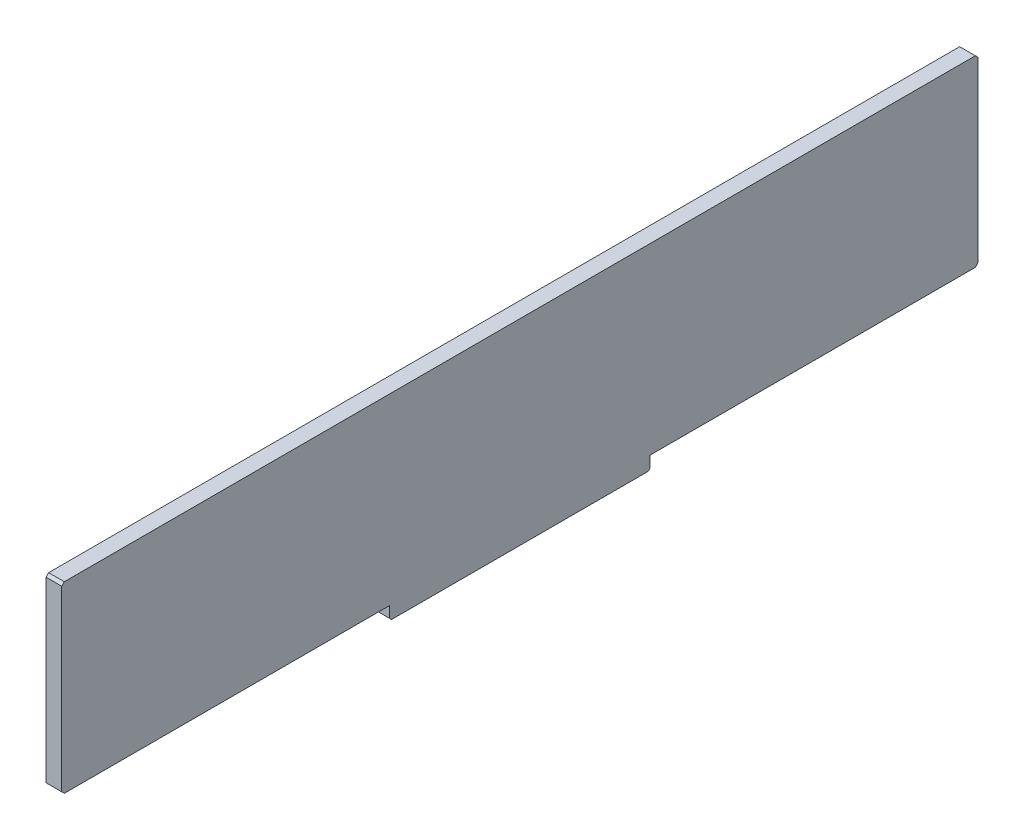
ISO-10303-21;
HEADER;
FILE_DESCRIPTION(('STEP AP214'),'2;1');
FILE_NAME('part.step','',(''),(''),'','','');
FILE_SCHEMA(('AUTOMOTIVE_DESIGN { 1 0 10303 214 1 1 1 1 }'));
ENDSEC;
DATA;
#1=APPLICATION_CONTEXT('core data for automotive mechanical design processes');
#2=APPLICATION_PROTOCOL_DEFINITION('international standard','automotive_design',2000,#1);
#3=PRODUCT_CONTEXT('',#1,'mechanical');
#4=PRODUCT('Part','Part','',(#3));
#5=PRODUCT_RELATED_PRODUCT_CATEGORY('part','',(#4));
#6=PRODUCT_DEFINITION_FORMATION('','',#4);
#7=PRODUCT_DEFINITION_CONTEXT('part definition',#1,'design');
#8=PRODUCT_DEFINITION('design','',#6,#7);
#9=PRODUCT_DEFINITION_SHAPE('','',#8);
#10=(LENGTH_UNIT() NAMED_UNIT(*) SI_UNIT(.MILLI.,.METRE.));
#11=(NAMED_UNIT(*) PLANE_ANGLE_UNIT() SI_UNIT($,.RADIAN.));
#12=(NAMED_UNIT(*) SI_UNIT($,.STERADIAN.) SOLID_ANGLE_UNIT());
#13=UNCERTAINTY_MEASURE_WITH_UNIT(LENGTH_MEASURE(1.E-05),#10,'distance_accuracy_value','');
#14=(GEOMETRIC_REPRESENTATION_CONTEXT(3) GLOBAL_UNCERTAINTY_ASSIGNED_CONTEXT((#13)) GLOBAL_UNIT_ASSIGNED_CONTEXT((#10,
#11,#12)) REPRESENTATION_CONTEXT('',''));
#15=CARTESIAN_POINT('',(0.,0.,0.));
#16=DIRECTION('',(0.,0.,1.));
#17=DIRECTION('',(1.,0.,0.));
#18=AXIS2_PLACEMENT_3D('',#15,#16,#17);
#19=CARTESIAN_POINT('',(68.3493649053885,-37.5,-168.284572681198));
#20=DIRECTION('',(0.,0.,-1.));
#21=DIRECTION('',(-1.,0.,0.));
#22=AXIS2_PLACEMENT_3D('',#19,#20,#21);
#23=PLANE('',#22);
#24=DIRECTION('',(0.,1.,0.));
#25=VECTOR('',#24,1.);
#26=CARTESIAN_POINT('',(68.3493649053885,-37.5,-168.284572681198));
#27=LINE('',#26,#25);
#28=CARTESIAN_POINT('',(68.3493649053885,-37.1,-168.284572681198));
#29=VERTEX_POINT('',#28);
#30=CARTESIAN_POINT('',(68.3493649053885,-35.,-168.284572681198));
#31=VERTEX_POINT('',#30);
#32=EDGE_CURVE('E180',#29,#31,#27,.T.);
#33=ORIENTED_EDGE('',*,*,#32,.F.);
#34=DIRECTION('',(-1.,0.,0.));
#35=VECTOR('',#34,1.);
#36=CARTESIAN_POINT('',(68.3493649053885,-37.1,-168.284572681198));
#37=LINE('',#36,#35);
#38=CARTESIAN_POINT('',(65.3493649053885,-37.1,-168.284572681198));
#39=VERTEX_POINT('',#38);
#40=EDGE_CURVE('E43',#29,#39,#37,.T.);
#41=ORIENTED_EDGE('',*,*,#40,.T.);
#42=DIRECTION('',(0.,1.,0.));
#43=VECTOR('',#42,1.);
#44=CARTESIAN_POINT('',(65.3493649053885,-37.5,-168.284572681198));
#45=LINE('',#44,#43);
#46=CARTESIAN_POINT('',(65.3493649053885,-35.,-168.284572681198));
#47=VERTEX_POINT('',#46);
#48=EDGE_CURVE('E170',#39,#47,#45,.T.);
#49=ORIENTED_EDGE('',*,*,#48,.T.);
#50=DIRECTION('',(-1.,0.,0.));
#51=VECTOR('',#50,1.);
#52=CARTESIAN_POINT('',(68.3493649053885,-35.,-168.284572681198));
#53=LINE('',#52,#51);
#54=EDGE_CURVE('E176',#31,#47,#53,.T.);
#55=ORIENTED_EDGE('',*,*,#54,.F.);
#56=EDGE_LOOP('',(#33,#41,#49,#55));
#57=FACE_BOUND('',#56,.T.);
#58=ADVANCED_FACE('F40',(#57),#23,.T.);
#59=CARTESIAN_POINT('',(68.3493649053885,-37.5,-168.384572681198));
#60=DIRECTION('',(-1.,0.,0.));
#61=DIRECTION('',(0.,0.,1.));
#62=AXIS2_PLACEMENT_3D('',#59,#60,#61);
#63=PLANE('',#62);
#64=DIRECTION('',(0.,1.,0.));
#65=VECTOR('',#64,1.);
#66=CARTESIAN_POINT('',(68.3493649053885,-37.5,-118.484572681198));
#67=LINE('',#66,#65);
#68=CARTESIAN_POINT('',(68.3493649053885,-37.1,-118.484572681198));
#69=VERTEX_POINT('',#68);
#70=CARTESIAN_POINT('',(68.3493649053885,-35.,-118.484572681198));
#71=VERTEX_POINT('',#70);
#72=EDGE_CURVE('E169',#69,#71,#67,.T.);
#73=ORIENTED_EDGE('',*,*,#72,.F.);
#74=DIRECTION('',(0.,0.707106781186557,0.707106781186538));
#75=VECTOR('',#74,1.);
#76=CARTESIAN_POINT('',(68.3493649053885,-37.4999999999999,-118.884572681198));
#77=LINE('',#76,#75);
#78=CARTESIAN_POINT('',(68.3493649053885,-37.5,-118.884572681198));
#79=VERTEX_POINT('',#78);
#80=EDGE_CURVE('E243',#69,#79,#77,.F.);
#81=ORIENTED_EDGE('',*,*,#80,.T.);
#82=DIRECTION('',(0.,0.,1.));
#83=VECTOR('',#82,1.);
#84=CARTESIAN_POINT('',(68.3493649053885,-37.5,-168.384572681198));
#85=LINE('',#84,#83);
#86=CARTESIAN_POINT('',(68.3493649053885,-37.5,-167.884572681198));
#87=VERTEX_POINT('',#86);
#88=EDGE_CURVE('E191',#87,#79,#85,.T.);
#89=ORIENTED_EDGE('',*,*,#88,.F.);
#90=DIRECTION('',(0.,0.707106781186538,-0.707106781186557));
#91=VECTOR('',#90,1.);
#92=CARTESIAN_POINT('',(68.3493649053885,-37.,-168.384572681198));
#93=LINE('',#92,#91);
#94=EDGE_CURVE('E239',#87,#29,#93,.T.);
#95=ORIENTED_EDGE('',*,*,#94,.T.);
#96=ORIENTED_EDGE('',*,*,#32,.T.);
#97=DIRECTION('',(0.,0.,-1.));
#98=VECTOR('',#97,1.);
#99=CARTESIAN_POINT('',(68.3493649053884,-35.,-55.8845726812005));
#100=LINE('',#99,#98);
#101=CARTESIAN_POINT('',(68.3493649053885,-35.,-230.3845726812));
#102=VERTEX_POINT('',#101);
#103=EDGE_CURVE('E147',#31,#102,#100,.T.);
#104=ORIENTED_EDGE('',*,*,#103,.T.);
#105=DIRECTION('',(0.,-0.707106781186548,0.707106781186547));
#106=VECTOR('',#105,1.);
#107=CARTESIAN_POINT('',(68.3493649053885,-35.,-230.3845726812));
#108=LINE('',#107,#106);
#109=CARTESIAN_POINT('',(68.3493649053885,-34.5,-230.8845726812));
#110=VERTEX_POINT('',#109);
#111=EDGE_CURVE('E233',#102,#110,#108,.F.);
#112=ORIENTED_EDGE('',*,*,#111,.T.);
#113=DIRECTION('',(0.,1.,0.));
#114=VECTOR('',#113,1.);
#115=CARTESIAN_POINT('',(68.3493649053885,0.,-230.8845726812));
#116=LINE('',#115,#114);
#117=CARTESIAN_POINT('',(68.3493649053885,-0.5,-230.8845726812));
#118=VERTEX_POINT('',#117);
#119=EDGE_CURVE('E282',#110,#118,#116,.T.);
#120=ORIENTED_EDGE('',*,*,#119,.T.);
#121=DIRECTION('',(0.,-0.707106781186599,-0.707106781186496));
#122=VECTOR('',#121,1.);
#123=CARTESIAN_POINT('',(68.3493649053885,-0.5,-230.8845726812));
#124=LINE('',#123,#122);
#125=CARTESIAN_POINT('',(68.3493649053885,0.,-230.384572681201));
#126=VERTEX_POINT('',#125);
#127=EDGE_CURVE('E236',#118,#126,#124,.F.);
#128=ORIENTED_EDGE('',*,*,#127,.T.);
#129=DIRECTION('',(0.,0.,1.));
#130=VECTOR('',#129,1.);
#131=CARTESIAN_POINT('',(68.3493649053884,0.,-55.8845726812005));
#132=LINE('',#131,#130);
#133=CARTESIAN_POINT('',(68.3493649053884,0.,-56.3845726812005));
#134=VERTEX_POINT('',#133);
#135=EDGE_CURVE('E129',#126,#134,#132,.T.);
#136=ORIENTED_EDGE('',*,*,#135,.T.);
#137=DIRECTION('',(0.,0.707106781186544,-0.707106781186551));
#138=VECTOR('',#137,1.);
#139=CARTESIAN_POINT('',(68.3493649053885,0.,-56.3845726812005));
#140=LINE('',#139,#138);
#141=CARTESIAN_POINT('',(68.3493649053884,-0.500000000000049,-55.8845726812005));
#142=VERTEX_POINT('',#141);
#143=EDGE_CURVE('E123',#134,#142,#140,.F.);
#144=ORIENTED_EDGE('',*,*,#143,.T.);
#145=DIRECTION('',(0.,-1.,0.));
#146=VECTOR('',#145,1.);
#147=CARTESIAN_POINT('',(68.3493649053884,0.,-55.8845726812005));
#148=LINE('',#147,#146);
#149=CARTESIAN_POINT('',(68.3493649053884,-34.4999999999999,-55.8845726812005));
#150=VERTEX_POINT('',#149);
#151=EDGE_CURVE('E127',#142,#150,#148,.T.);
#152=ORIENTED_EDGE('',*,*,#151,.T.);
#153=DIRECTION('',(0.,0.707106781186584,0.707106781186512));
#154=VECTOR('',#153,1.);
#155=CARTESIAN_POINT('',(68.3493649053885,-34.4999999999999,-55.8845726812005));
#156=LINE('',#155,#154);
#157=CARTESIAN_POINT('',(68.3493649053884,-35.,-56.3845726812005));
#158=VERTEX_POINT('',#157);
#159=EDGE_CURVE('E59',#150,#158,#156,.F.);
#160=ORIENTED_EDGE('',*,*,#159,.T.);
#161=EDGE_CURVE('E286',#158,#71,#100,.T.);
#162=ORIENTED_EDGE('',*,*,#161,.T.);
#163=EDGE_LOOP('',(#73,#81,#89,#95,#96,#104,#112,#120,#128,#136,#144,#152,#160,#162));
#164=FACE_BOUND('',#163,.T.);
#165=ADVANCED_FACE('F126',(#164),#63,.F.);
#166=CARTESIAN_POINT('',(68.3493649053885,-37.5,-118.484572681198));
#167=DIRECTION('',(0.,0.,-1.));
#168=DIRECTION('',(-1.,0.,0.));
#169=AXIS2_PLACEMENT_3D('',#166,#167,#168);
#170=PLANE('',#169);
#171=DIRECTION('',(0.,1.,0.));
#172=VECTOR('',#171,1.);
#173=CARTESIAN_POINT('',(65.3493649053885,-37.5,-118.484572681198));
#174=LINE('',#173,#172);
#175=CARTESIAN_POINT('',(65.3493649053885,-37.1,-118.484572681198));
#176=VERTEX_POINT('',#175);
#177=CARTESIAN_POINT('',(65.3493649053885,-35.,-118.484572681198));
#178=VERTEX_POINT('',#177);
#179=EDGE_CURVE('E165',#176,#178,#174,.T.);
#180=ORIENTED_EDGE('',*,*,#179,.F.);
#181=DIRECTION('',(-1.,0.,0.));
#182=VECTOR('',#181,1.);
#183=CARTESIAN_POINT('',(-111.650635094611,-37.1,-118.484572681198));
#184=LINE('',#183,#182);
#185=EDGE_CURVE('E135',#176,#69,#184,.F.);
#186=ORIENTED_EDGE('',*,*,#185,.T.);
#187=ORIENTED_EDGE('',*,*,#72,.T.);
#188=DIRECTION('',(-1.,0.,0.));
#189=VECTOR('',#188,1.);
#190=CARTESIAN_POINT('',(68.3493649053885,-35.,-118.484572681198));
#191=LINE('',#190,#189);
#192=EDGE_CURVE('E171',#71,#178,#191,.T.);
#193=ORIENTED_EDGE('',*,*,#192,.T.);
#194=EDGE_LOOP('',(#180,#186,#187,#193));
#195=FACE_BOUND('',#194,.T.);
#196=ADVANCED_FACE('F354',(#195),#170,.F.);
#197=CARTESIAN_POINT('',(65.3493649053885,-37.5,-168.384572681198));
#198=DIRECTION('',(-1.,0.,0.));
#199=DIRECTION('',(0.,0.,1.));
#200=AXIS2_PLACEMENT_3D('',#197,#198,#199);
#201=PLANE('',#200);
#202=DIRECTION('',(0.,0.,1.));
#203=VECTOR('',#202,1.);
#204=CARTESIAN_POINT('',(65.3493649053885,-37.5,-168.384572681198));
#205=LINE('',#204,#203);
#206=CARTESIAN_POINT('',(65.3493649053885,-37.5,-167.884572681198));
#207=VERTEX_POINT('',#206);
#208=CARTESIAN_POINT('',(65.3493649053885,-37.5,-118.884572681198));
#209=VERTEX_POINT('',#208);
#210=EDGE_CURVE('E175',#207,#209,#205,.T.);
#211=ORIENTED_EDGE('',*,*,#210,.T.);
#212=DIRECTION('',(0.,-0.707106781186557,-0.707106781186538));
#213=VECTOR('',#212,1.);
#214=CARTESIAN_POINT('',(65.3493649053885,-62.25,-143.634572681197));
#215=LINE('',#214,#213);
#216=EDGE_CURVE('E183',#209,#176,#215,.F.);
#217=ORIENTED_EDGE('',*,*,#216,.T.);
#218=ORIENTED_EDGE('',*,*,#179,.T.);
#219=DIRECTION('',(0.,0.,-1.));
#220=VECTOR('',#219,1.);
#221=CARTESIAN_POINT('',(65.3493649053884,-35.,-55.8845726812005));
#222=LINE('',#221,#220);
#223=CARTESIAN_POINT('',(65.3493649053885,-35.,-56.3845726812005));
#224=VERTEX_POINT('',#223);
#225=EDGE_CURVE('E296',#224,#178,#222,.T.);
#226=ORIENTED_EDGE('',*,*,#225,.F.);
#227=DIRECTION('',(0.,-0.707106781186584,-0.707106781186512));
#228=VECTOR('',#227,1.);
#229=CARTESIAN_POINT('',(65.3493649053885,-92.2499999999989,-113.634572681194));
#230=LINE('',#229,#228);
#231=CARTESIAN_POINT('',(65.3493649053884,-34.4999999999999,-55.8845726812005));
#232=VERTEX_POINT('',#231);
#233=EDGE_CURVE('E218',#224,#232,#230,.F.);
#234=ORIENTED_EDGE('',*,*,#233,.T.);
#235=DIRECTION('',(0.,-1.,0.));
#236=VECTOR('',#235,1.);
#237=CARTESIAN_POINT('',(65.3493649053884,0.,-55.8845726812005));
#238=LINE('',#237,#236);
#239=CARTESIAN_POINT('',(65.3493649053884,-0.500000000000049,-55.8845726812005));
#240=VERTEX_POINT('',#239);
#241=EDGE_CURVE('E291',#240,#232,#238,.T.);
#242=ORIENTED_EDGE('',*,*,#241,.F.);
#243=DIRECTION('',(0.,-0.707106781186544,0.707106781186551));
#244=VECTOR('',#243,1.);
#245=CARTESIAN_POINT('',(65.3493649053885,37.249999999999,-93.6345726811999));
#246=LINE('',#245,#244);
#247=CARTESIAN_POINT('',(65.3493649053885,0.,-56.3845726812005));
#248=VERTEX_POINT('',#247);
#249=EDGE_CURVE('E152',#240,#248,#246,.F.);
#250=ORIENTED_EDGE('',*,*,#249,.T.);
#251=DIRECTION('',(0.,0.,1.));
#252=VECTOR('',#251,1.);
#253=CARTESIAN_POINT('',(65.3493649053884,0.,-55.8845726812005));
#254=LINE('',#253,#252);
#255=CARTESIAN_POINT('',(65.3493649053885,0.,-230.384572681201));
#256=VERTEX_POINT('',#255);
#257=EDGE_CURVE('E189',#256,#248,#254,.T.);
#258=ORIENTED_EDGE('',*,*,#257,.F.);
#259=DIRECTION('',(0.,0.707106781186599,0.707106781186496));
#260=VECTOR('',#259,1.);
#261=CARTESIAN_POINT('',(65.3493649053886,12.2499999999985,-218.134572681204));
#262=LINE('',#261,#260);
#263=CARTESIAN_POINT('',(65.3493649053885,-0.5,-230.8845726812));
#264=VERTEX_POINT('',#263);
#265=EDGE_CURVE('E224',#256,#264,#262,.F.);
#266=ORIENTED_EDGE('',*,*,#265,.T.);
#267=DIRECTION('',(0.,1.,0.));
#268=VECTOR('',#267,1.);
#269=CARTESIAN_POINT('',(65.3493649053885,0.,-230.8845726812));
#270=LINE('',#269,#268);
#271=CARTESIAN_POINT('',(65.3493649053885,-34.5,-230.8845726812));
#272=VERTEX_POINT('',#271);
#273=EDGE_CURVE('E274',#272,#264,#270,.T.);
#274=ORIENTED_EDGE('',*,*,#273,.F.);
#275=DIRECTION('',(0.,0.707106781186548,-0.707106781186547));
#276=VECTOR('',#275,1.);
#277=CARTESIAN_POINT('',(65.3493649053885,-67.2500000000012,-198.134572681199));
#278=LINE('',#277,#276);
#279=CARTESIAN_POINT('',(65.3493649053885,-35.,-230.3845726812));
#280=VERTEX_POINT('',#279);
#281=EDGE_CURVE('E100',#272,#280,#278,.F.);
#282=ORIENTED_EDGE('',*,*,#281,.T.);
#283=EDGE_CURVE('E299',#47,#280,#222,.T.);
#284=ORIENTED_EDGE('',*,*,#283,.F.);
#285=ORIENTED_EDGE('',*,*,#48,.F.);
#286=DIRECTION('',(0.,-0.707106781186538,0.707106781186557));
#287=VECTOR('',#286,1.);
#288=CARTESIAN_POINT('',(65.3493649053885,-37.25,-168.134572681198));
#289=LINE('',#288,#287);
#290=EDGE_CURVE('E91',#39,#207,#289,.T.);
#291=ORIENTED_EDGE('',*,*,#290,.T.);
#292=EDGE_LOOP('',(#211,#217,#218,#226,#234,#242,#250,#258,#266,#274,#282,#284,#285,#291));
#293=FACE_BOUND('',#292,.T.);
#294=ADVANCED_FACE('F271',(#293),#201,.T.);
#295=CARTESIAN_POINT('',(-111.650635094611,-37.5,-143.3845726812));
#296=DIRECTION('',(0.,1.,0.));
#297=DIRECTION('',(-0.866025403784445,0.,0.499999999999988));
#298=AXIS2_PLACEMENT_3D('',#295,#296,#297);
#299=PLANE('',#298);
#300=ORIENTED_EDGE('',*,*,#88,.T.);
#301=DIRECTION('',(-1.,0.,0.));
#302=VECTOR('',#301,1.);
#303=CARTESIAN_POINT('',(-111.650635094611,-37.5,-118.884572681198));
#304=LINE('',#303,#302);
#305=EDGE_CURVE('E213',#79,#209,#304,.T.);
#306=ORIENTED_EDGE('',*,*,#305,.T.);
#307=ORIENTED_EDGE('',*,*,#210,.F.);
#308=DIRECTION('',(1.,0.,0.));
#309=VECTOR('',#308,1.);
#310=CARTESIAN_POINT('',(68.3493649053885,-37.5,-167.884572681198));
#311=LINE('',#310,#309);
#312=EDGE_CURVE('E186',#207,#87,#311,.T.);
#313=ORIENTED_EDGE('',*,*,#312,.T.);
#314=EDGE_LOOP('',(#300,#306,#307,#313));
#315=FACE_BOUND('',#314,.T.);
#316=ADVANCED_FACE('F321',(#315),#299,.F.);
#317=CARTESIAN_POINT('',(65.3493649053884,-35.,-55.8845726812005));
#318=DIRECTION('',(0.,-1.,0.));
#319=DIRECTION('',(0.499999999999988,0.,0.866025403784445));
#320=AXIS2_PLACEMENT_3D('',#317,#318,#319);
#321=PLANE('',#320);
#322=ORIENTED_EDGE('',*,*,#161,.F.);
#323=DIRECTION('',(-1.,0.,0.));
#324=VECTOR('',#323,1.);
#325=CARTESIAN_POINT('',(65.3493649053885,-35.,-56.3845726812005));
#326=LINE('',#325,#324);
#327=EDGE_CURVE('E12',#158,#224,#326,.T.);
#328=ORIENTED_EDGE('',*,*,#327,.T.);
#329=ORIENTED_EDGE('',*,*,#225,.T.);
#330=ORIENTED_EDGE('',*,*,#192,.F.);
#331=EDGE_LOOP('',(#322,#328,#329,#330));
#332=FACE_BOUND('',#331,.T.);
#333=ADVANCED_FACE('F365',(#332),#321,.T.);
#334=CARTESIAN_POINT('',(65.3493649053884,0.,-55.8845726812005));
#335=DIRECTION('',(0.,0.,1.));
#336=DIRECTION('',(1.,0.,0.));
#337=AXIS2_PLACEMENT_3D('',#334,#335,#336);
#338=PLANE('',#337);
#339=ORIENTED_EDGE('',*,*,#241,.T.);
#340=DIRECTION('',(1.,0.,0.));
#341=VECTOR('',#340,1.);
#342=CARTESIAN_POINT('',(65.3493649053884,-34.4999999999999,-55.8845726812005));
#343=LINE('',#342,#341);
#344=EDGE_CURVE('E50',#232,#150,#343,.T.);
#345=ORIENTED_EDGE('',*,*,#344,.T.);
#346=ORIENTED_EDGE('',*,*,#151,.F.);
#347=DIRECTION('',(-1.,0.,0.));
#348=VECTOR('',#347,1.);
#349=CARTESIAN_POINT('',(65.3493649053884,-0.500000000000049,-55.8845726812005));
#350=LINE('',#349,#348);
#351=EDGE_CURVE('E143',#142,#240,#350,.T.);
#352=ORIENTED_EDGE('',*,*,#351,.T.);
#353=EDGE_LOOP('',(#339,#345,#346,#352));
#354=FACE_BOUND('',#353,.T.);
#355=ADVANCED_FACE('F141',(#354),#338,.T.);
#356=CARTESIAN_POINT('',(65.3493649053884,0.,-55.8845726812005));
#357=DIRECTION('',(0.,1.,0.));
#358=DIRECTION('',(-0.499999999999988,0.,-0.866025403784445));
#359=AXIS2_PLACEMENT_3D('',#356,#357,#358);
#360=PLANE('',#359);
#361=ORIENTED_EDGE('',*,*,#135,.F.);
#362=DIRECTION('',(-1.,0.,0.));
#363=VECTOR('',#362,1.);
#364=CARTESIAN_POINT('',(65.3493649053885,0.,-230.384572681201));
#365=LINE('',#364,#363);
#366=EDGE_CURVE('E161',#126,#256,#365,.T.);
#367=ORIENTED_EDGE('',*,*,#366,.T.);
#368=ORIENTED_EDGE('',*,*,#257,.T.);
#369=DIRECTION('',(1.,0.,0.));
#370=VECTOR('',#369,1.);
#371=CARTESIAN_POINT('',(65.3493649053885,0.,-56.3845726812005));
#372=LINE('',#371,#370);
#373=EDGE_CURVE('E255',#248,#134,#372,.T.);
#374=ORIENTED_EDGE('',*,*,#373,.T.);
#375=EDGE_LOOP('',(#361,#367,#368,#374));
#376=FACE_BOUND('',#375,.T.);
#377=ADVANCED_FACE('F265',(#376),#360,.T.);
#378=CARTESIAN_POINT('',(65.3493649053885,0.,-230.8845726812));
#379=DIRECTION('',(0.,0.,-1.));
#380=DIRECTION('',(-1.,0.,0.));
#381=AXIS2_PLACEMENT_3D('',#378,#379,#380);
#382=PLANE('',#381);
#383=ORIENTED_EDGE('',*,*,#273,.T.);
#384=DIRECTION('',(1.,0.,0.));
#385=VECTOR('',#384,1.);
#386=CARTESIAN_POINT('',(65.3493649053885,-0.5,-230.8845726812));
#387=LINE('',#386,#385);
#388=EDGE_CURVE('E251',#264,#118,#387,.T.);
#389=ORIENTED_EDGE('',*,*,#388,.T.);
#390=ORIENTED_EDGE('',*,*,#119,.F.);
#391=DIRECTION('',(-1.,0.,0.));
#392=VECTOR('',#391,1.);
#393=CARTESIAN_POINT('',(65.3493649053885,-34.5,-230.8845726812));
#394=LINE('',#393,#392);
#395=EDGE_CURVE('E247',#110,#272,#394,.T.);
#396=ORIENTED_EDGE('',*,*,#395,.T.);
#397=EDGE_LOOP('',(#383,#389,#390,#396));
#398=FACE_BOUND('',#397,.T.);
#399=ADVANCED_FACE('F281',(#398),#382,.T.);
#400=ORIENTED_EDGE('',*,*,#283,.T.);
#401=DIRECTION('',(1.,0.,0.));
#402=VECTOR('',#401,1.);
#403=CARTESIAN_POINT('',(65.3493649053885,-35.,-230.3845726812));
#404=LINE('',#403,#402);
#405=EDGE_CURVE('E154',#280,#102,#404,.T.);
#406=ORIENTED_EDGE('',*,*,#405,.T.);
#407=ORIENTED_EDGE('',*,*,#103,.F.);
#408=ORIENTED_EDGE('',*,*,#54,.T.);
#409=EDGE_LOOP('',(#400,#406,#407,#408));
#410=FACE_BOUND('',#409,.T.);
#411=ADVANCED_FACE('F306',(#410),#321,.T.);
#412=CARTESIAN_POINT('',(-111.650635094611,-37.5,-118.884572681198));
#413=DIRECTION('',(0.,0.707106781186538,-0.707106781186557));
#414=DIRECTION('',(-1.,0.,0.));
#415=AXIS2_PLACEMENT_3D('',#412,#413,#414);
#416=PLANE('',#415);
#417=ORIENTED_EDGE('',*,*,#80,.F.);
#418=ORIENTED_EDGE('',*,*,#185,.F.);
#419=ORIENTED_EDGE('',*,*,#216,.F.);
#420=ORIENTED_EDGE('',*,*,#305,.F.);
#421=EDGE_LOOP('',(#417,#418,#419,#420));
#422=FACE_BOUND('',#421,.T.);
#423=ADVANCED_FACE('F356',(#422),#416,.F.);
#424=CARTESIAN_POINT('',(68.3493649053885,-37.,-168.384572681198));
#425=DIRECTION('',(0.,-0.707106781186557,-0.707106781186538));
#426=DIRECTION('',(1.,0.,0.));
#427=AXIS2_PLACEMENT_3D('',#424,#425,#426);
#428=PLANE('',#427);
#429=ORIENTED_EDGE('',*,*,#94,.F.);
#430=ORIENTED_EDGE('',*,*,#312,.F.);
#431=ORIENTED_EDGE('',*,*,#290,.F.);
#432=ORIENTED_EDGE('',*,*,#40,.F.);
#433=EDGE_LOOP('',(#429,#430,#431,#432));
#434=FACE_BOUND('',#433,.T.);
#435=ADVANCED_FACE('F325',(#434),#428,.T.);
#436=CARTESIAN_POINT('',(65.3493649053885,-0.5,-230.8845726812));
#437=DIRECTION('',(0.,-0.707106781186496,0.707106781186599));
#438=DIRECTION('',(1.,0.,0.));
#439=AXIS2_PLACEMENT_3D('',#436,#437,#438);
#440=PLANE('',#439);
#441=ORIENTED_EDGE('',*,*,#265,.F.);
#442=ORIENTED_EDGE('',*,*,#366,.F.);
#443=ORIENTED_EDGE('',*,*,#127,.F.);
#444=ORIENTED_EDGE('',*,*,#388,.F.);
#445=EDGE_LOOP('',(#441,#442,#443,#444));
#446=FACE_BOUND('',#445,.T.);
#447=ADVANCED_FACE('F277',(#446),#440,.F.);
#448=CARTESIAN_POINT('',(65.3493649053885,-35.,-230.3845726812));
#449=DIRECTION('',(0.,0.707106781186547,0.707106781186548));
#450=DIRECTION('',(1.,0.,0.));
#451=AXIS2_PLACEMENT_3D('',#448,#449,#450);
#452=PLANE('',#451);
#453=ORIENTED_EDGE('',*,*,#281,.F.);
#454=ORIENTED_EDGE('',*,*,#395,.F.);
#455=ORIENTED_EDGE('',*,*,#111,.F.);
#456=ORIENTED_EDGE('',*,*,#405,.F.);
#457=EDGE_LOOP('',(#453,#454,#455,#456));
#458=FACE_BOUND('',#457,.T.);
#459=ADVANCED_FACE('F309',(#458),#452,.F.);
#460=CARTESIAN_POINT('',(65.3493649053884,-34.4999999999999,-55.8845726812005));
#461=DIRECTION('',(0.,0.707106781186511,-0.707106781186583));
#462=DIRECTION('',(1.,0.,0.));
#463=AXIS2_PLACEMENT_3D('',#460,#461,#462);
#464=PLANE('',#463);
#465=ORIENTED_EDGE('',*,*,#233,.F.);
#466=ORIENTED_EDGE('',*,*,#327,.F.);
#467=ORIENTED_EDGE('',*,*,#159,.F.);
#468=ORIENTED_EDGE('',*,*,#344,.F.);
#469=EDGE_LOOP('',(#465,#466,#467,#468));
#470=FACE_BOUND('',#469,.T.);
#471=ADVANCED_FACE('F432',(#470),#464,.F.);
#472=CARTESIAN_POINT('',(65.3493649053885,0.,-56.3845726812005));
#473=DIRECTION('',(0.,-0.707106781186551,-0.707106781186544));
#474=DIRECTION('',(1.,0.,0.));
#475=AXIS2_PLACEMENT_3D('',#472,#473,#474);
#476=PLANE('',#475);
#477=ORIENTED_EDGE('',*,*,#249,.F.);
#478=ORIENTED_EDGE('',*,*,#351,.F.);
#479=ORIENTED_EDGE('',*,*,#143,.F.);
#480=ORIENTED_EDGE('',*,*,#373,.F.);
#481=EDGE_LOOP('',(#477,#478,#479,#480));
#482=FACE_BOUND('',#481,.T.);
#483=ADVANCED_FACE('F150',(#482),#476,.F.);
#484=CLOSED_SHELL('',(#58,#165,#196,#294,#316,#333,#355,#377,#399,#411,#423,#435,#447,#459,#471,#483));
#485=MANIFOLD_SOLID_BREP('B2',#484);
#486=ADVANCED_BREP_SHAPE_REPRESENTATION('',(#18,#485),#14);
#487=SHAPE_DEFINITION_REPRESENTATION(#9,#486);
ENDSEC;
END-ISO-10303-21;
